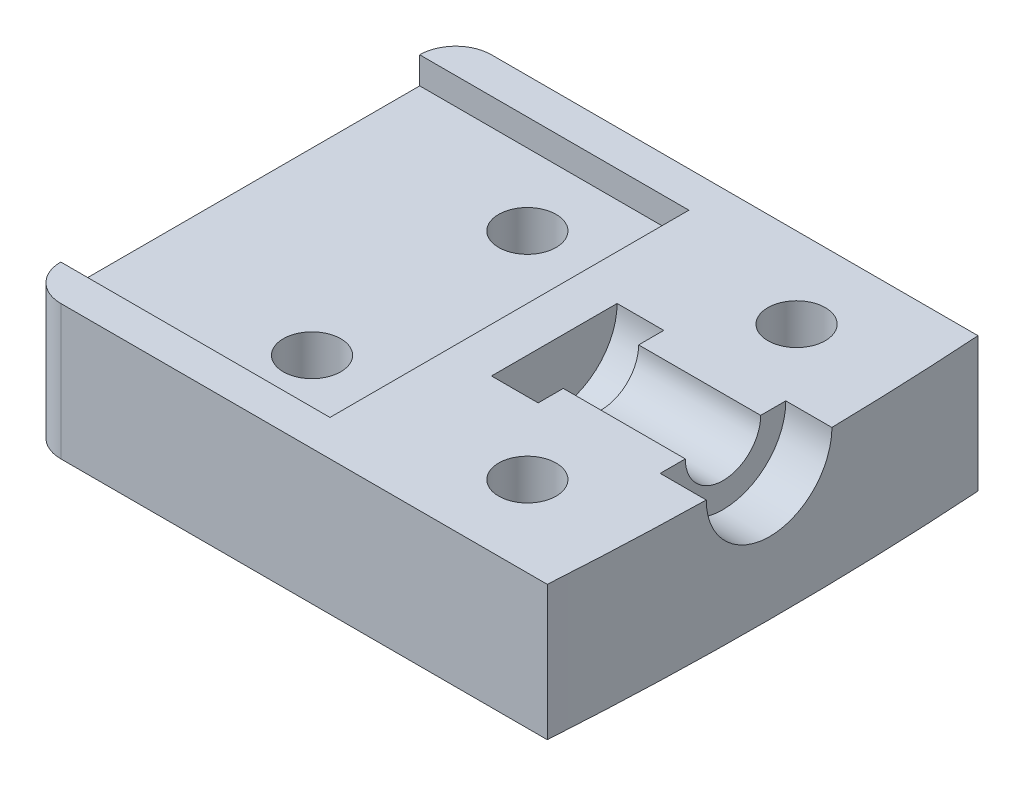
ISO-10303-21;
HEADER;
FILE_DESCRIPTION(('STEP AP214'),'2;1');
FILE_NAME('part.step','',(''),(''),'','','');
FILE_SCHEMA(('AUTOMOTIVE_DESIGN { 1 0 10303 214 1 1 1 1 }'));
ENDSEC;
DATA;
#1=APPLICATION_CONTEXT('core data for automotive mechanical design processes');
#2=APPLICATION_PROTOCOL_DEFINITION('international standard','automotive_design',2000,#1);
#3=PRODUCT_CONTEXT('',#1,'mechanical');
#4=PRODUCT('Part','Part','',(#3));
#5=PRODUCT_RELATED_PRODUCT_CATEGORY('part','',(#4));
#6=PRODUCT_DEFINITION_FORMATION('','',#4);
#7=PRODUCT_DEFINITION_CONTEXT('part definition',#1,'design');
#8=PRODUCT_DEFINITION('design','',#6,#7);
#9=PRODUCT_DEFINITION_SHAPE('','',#8);
#10=(LENGTH_UNIT() NAMED_UNIT(*) SI_UNIT(.MILLI.,.METRE.));
#11=(NAMED_UNIT(*) PLANE_ANGLE_UNIT() SI_UNIT($,.RADIAN.));
#12=(NAMED_UNIT(*) SI_UNIT($,.STERADIAN.) SOLID_ANGLE_UNIT());
#13=UNCERTAINTY_MEASURE_WITH_UNIT(LENGTH_MEASURE(1.E-05),#10,'distance_accuracy_value','');
#14=(GEOMETRIC_REPRESENTATION_CONTEXT(3) GLOBAL_UNCERTAINTY_ASSIGNED_CONTEXT((#13)) GLOBAL_UNIT_ASSIGNED_CONTEXT((#10,
#11,#12)) REPRESENTATION_CONTEXT('',''));
#15=CARTESIAN_POINT('',(0.,0.,0.));
#16=DIRECTION('',(0.,0.,1.));
#17=DIRECTION('',(1.,0.,0.));
#18=AXIS2_PLACEMENT_3D('',#15,#16,#17);
#19=CARTESIAN_POINT('',(-180.,10.,0.));
#20=DIRECTION('',(0.,-1.,0.));
#21=DIRECTION('',(0.,0.,-1.));
#22=AXIS2_PLACEMENT_3D('',#19,#20,#21);
#23=CYLINDRICAL_SURFACE('',#22,184.5);
#24=CARTESIAN_POINT('',(-180.,2.5,0.));
#25=DIRECTION('',(0.,-1.,0.));
#26=DIRECTION('',(0.,0.,-1.));
#27=AXIS2_PLACEMENT_3D('',#24,#25,#26);
#28=CIRCLE('',#27,184.5);
#29=CARTESIAN_POINT('',(4.10934251145431,2.5,-12.));
#30=VERTEX_POINT('',#29);
#31=CARTESIAN_POINT('',(4.10934251145434,2.5,11.9999999999999));
#32=VERTEX_POINT('',#31);
#33=EDGE_CURVE('E452',#30,#32,#28,.T.);
#34=ORIENTED_EDGE('',*,*,#33,.F.);
#35=DIRECTION('',(0.,-1.,0.));
#36=VECTOR('',#35,1.);
#37=CARTESIAN_POINT('',(4.10934251145431,10.,-12.));
#38=LINE('',#37,#36);
#39=CARTESIAN_POINT('',(4.10934251145431,10.,-12.));
#40=VERTEX_POINT('',#39);
#41=EDGE_CURVE('E483',#40,#30,#38,.T.);
#42=ORIENTED_EDGE('',*,*,#41,.F.);
#43=CARTESIAN_POINT('',(-180.,10.,0.));
#44=DIRECTION('',(0.,1.,0.));
#45=DIRECTION('',(0.,0.,1.));
#46=AXIS2_PLACEMENT_3D('',#43,#44,#45);
#47=CIRCLE('',#46,184.5);
#48=CARTESIAN_POINT('',(4.466799180774,10.,-3.49999999999999));
#49=VERTEX_POINT('',#48);
#50=EDGE_CURVE('E212',#49,#40,#47,.T.);
#51=ORIENTED_EDGE('',*,*,#50,.F.);
#52=CARTESIAN_POINT('',(4.466799180774,10.,3.50000000000004));
#53=CARTESIAN_POINT('',(4.46679841469484,9.90156883949017,3.50000944073101));
#54=CARTESIAN_POINT('',(4.46687794884017,9.80314216415495,3.49584773706264));
#55=CARTESIAN_POINT('',(4.46719196113814,9.60699316771199,3.47925510625905));
#56=CARTESIAN_POINT('',(4.46742643176911,9.50927081264448,3.46682458054951));
#57=CARTESIAN_POINT('',(4.46804444212397,9.3152850470878,3.43377909437891));
#58=CARTESIAN_POINT('',(4.46842787587904,9.21902064990752,3.4131699517684));
#59=CARTESIAN_POINT('',(4.46933226037499,9.02859401788498,3.36393456617535));
#60=CARTESIAN_POINT('',(4.46985320946417,8.93443175780879,3.3353084194844));
#61=CARTESIAN_POINT('',(4.4716021949422,8.65601031225504,3.23763720472101));
#62=CARTESIAN_POINT('',(4.47301665161284,8.47573366495137,3.1567851819177));
#63=CARTESIAN_POINT('',(4.47618203614662,8.13144868007693,2.9660236783445));
#64=CARTESIAN_POINT('',(4.47793289880444,7.96743719916688,2.85611982711916));
#65=CARTESIAN_POINT('',(4.48157446184482,7.66014106708052,2.61031668822488));
#66=CARTESIAN_POINT('',(4.48346518095077,7.5168591987157,2.47441391605144));
#67=CARTESIAN_POINT('',(4.48717336279079,7.25512900030599,2.18046445104212));
#68=CARTESIAN_POINT('',(4.48899081432567,7.13668445518806,2.0224143893231));
#69=CARTESIAN_POINT('',(4.49234733296518,6.92800586730905,1.68866349075336));
#70=CARTESIAN_POINT('',(4.49388639135575,6.83777270753644,1.51296210166091));
#71=CARTESIAN_POINT('',(4.49651243295992,6.68809225276604,1.14891232960233));
#72=CARTESIAN_POINT('',(4.49759944542518,6.62864296569952,0.960564765879647));
#73=CARTESIAN_POINT('',(4.49919889920214,6.54221443939616,0.576579150258367));
#74=CARTESIAN_POINT('',(4.49971139884895,6.51523190351767,0.380941840633406));
#75=CARTESIAN_POINT('',(4.50010425031963,6.49449277140174,-0.012091085463029));
#76=CARTESIAN_POINT('',(4.49998458816447,6.50073690990807,-0.209486740720561));
#77=CARTESIAN_POINT('',(4.49912663588495,6.54627206885379,-0.600399584207507));
#78=CARTESIAN_POINT('',(4.49838843154618,6.58555850666067,-0.793917306456734));
#79=CARTESIAN_POINT('',(4.496376714074,6.69605590842844,-1.17160937422262));
#80=CARTESIAN_POINT('',(4.49510320240867,6.76726678483673,-1.35578374536182));
#81=CARTESIAN_POINT('',(4.49216425328444,6.93959851038055,-1.70958011360381));
#82=CARTESIAN_POINT('',(4.4904987799545,7.04072209724615,-1.8792007768595));
#83=CARTESIAN_POINT('',(4.48696376189953,7.27000169243456,-2.19905083417319));
#84=CARTESIAN_POINT('',(4.4850942269777,7.39815640244578,-2.34928115899557));
#85=CARTESIAN_POINT('',(4.48136165081317,7.67786522475498,-2.62610194026429));
#86=CARTESIAN_POINT('',(4.47949860972356,7.82941988490857,-2.75269184307155));
#87=CARTESIAN_POINT('',(4.47598849710449,8.1516914376529,-2.97867220008211));
#88=CARTESIAN_POINT('',(4.47434149429857,8.32241439593754,-3.07805401004511));
#89=CARTESIAN_POINT('',(4.47144900138497,8.67819825043069,-3.24679188167776));
#90=CARTESIAN_POINT('',(4.47020375725949,8.86326784489361,-3.31612955729461));
#91=CARTESIAN_POINT('',(4.46825852240572,9.24227992085637,-3.4226426623696));
#92=CARTESIAN_POINT('',(4.46755769930326,9.43620837527823,-3.4598671997978));
#93=CARTESIAN_POINT('',(4.4670445760719,9.69285640137631,-3.48704420247958));
#94=CARTESIAN_POINT('',(4.46695259987882,9.75423850120095,-3.49190518857658));
#95=CARTESIAN_POINT('',(4.46682998424966,9.87707210825866,-3.49837865277695));
#96=CARTESIAN_POINT('',(4.46679924361665,9.93852333277886,-3.49999649048409));
#97=CARTESIAN_POINT('',(4.46679918077402,10.,-3.49999999999999));
#98=B_SPLINE_CURVE_WITH_KNOTS('',3,(#52,#53,#54,#55,#56,#57,#58,#59,#60,#61,#62,#63,#64,#65,#66,
#67,#68,#69,#70,#71,#72,#73,#74,#75,#76,#77,#78,#79,#80,#81,#82,#83,#84,#85,#86,#87,#88,#89,#90,
#91,#92,#93,#94,#95,#96,#97),.UNSPECIFIED.,.F.,.F.,(4,2,2,2,2,2,2,2,2,2,2,2,2,2,2,2,2,2,2,2,2,2,
4),(0.,0.295197414552304,0.590380499231028,0.885353981043384,1.18032392010528,1.77001496545767,
2.35959182654858,2.94924776108713,3.53899348732108,4.12875767016575,4.7184836837499,
5.30814981208619,5.89782897980496,6.48742637847426,7.07702216018609,7.66667192075088,
8.25629336673689,8.84592861943703,9.43575098740061,10.0259337998151,10.6152124864058,
10.7998757467791,10.9842335815568),.UNSPECIFIED.);
#99=CARTESIAN_POINT('',(4.466799180774,10.,3.50000000000004));
#100=VERTEX_POINT('',#99);
#101=EDGE_CURVE('E205',#100,#49,#98,.T.);
#102=ORIENTED_EDGE('',*,*,#101,.F.);
#103=CARTESIAN_POINT('',(4.10934251145431,10.,12.));
#104=VERTEX_POINT('',#103);
#105=EDGE_CURVE('E200',#104,#100,#47,.T.);
#106=ORIENTED_EDGE('',*,*,#105,.F.);
#107=DIRECTION('',(0.,-1.,0.));
#108=VECTOR('',#107,1.);
#109=CARTESIAN_POINT('',(4.10934251145431,10.,12.));
#110=LINE('',#109,#108);
#111=EDGE_CURVE('E479',#104,#32,#110,.T.);
#112=ORIENTED_EDGE('',*,*,#111,.T.);
#113=EDGE_LOOP('',(#34,#42,#51,#102,#106,#112));
#114=FACE_BOUND('',#113,.T.);
#115=ADVANCED_FACE('F36',(#114),#23,.T.);
#116=CARTESIAN_POINT('',(-25.,10.,0.));
#117=DIRECTION('',(-1.,0.,0.));
#118=DIRECTION('',(0.,0.,1.));
#119=AXIS2_PLACEMENT_3D('',#116,#117,#118);
#120=PLANE('',#119);
#121=DIRECTION('',(0.,-1.,0.));
#122=VECTOR('',#121,1.);
#123=CARTESIAN_POINT('',(-25.,0.,-9.99999999999999));
#124=LINE('',#123,#122);
#125=CARTESIAN_POINT('',(-25.,8.5,-10.));
#126=VERTEX_POINT('',#125);
#127=CARTESIAN_POINT('',(-25.,2.5,-9.99999999999999));
#128=VERTEX_POINT('',#127);
#129=EDGE_CURVE('E159',#126,#128,#124,.T.);
#130=ORIENTED_EDGE('',*,*,#129,.T.);
#131=DIRECTION('',(0.,0.,-1.));
#132=VECTOR('',#131,1.);
#133=CARTESIAN_POINT('',(-25.,2.5,10.));
#134=LINE('',#133,#132);
#135=CARTESIAN_POINT('',(-25.,2.5,10.));
#136=VERTEX_POINT('',#135);
#137=EDGE_CURVE('E146',#136,#128,#134,.T.);
#138=ORIENTED_EDGE('',*,*,#137,.F.);
#139=DIRECTION('',(0.,-1.,0.));
#140=VECTOR('',#139,1.);
#141=CARTESIAN_POINT('',(-25.,10.,10.));
#142=LINE('',#141,#140);
#143=CARTESIAN_POINT('',(-25.,8.5,10.));
#144=VERTEX_POINT('',#143);
#145=EDGE_CURVE('E157',#136,#144,#142,.F.);
#146=ORIENTED_EDGE('',*,*,#145,.T.);
#147=DIRECTION('',(0.,0.,1.));
#148=VECTOR('',#147,1.);
#149=CARTESIAN_POINT('',(-25.,8.5,-10.));
#150=LINE('',#149,#148);
#151=EDGE_CURVE('E505',#126,#144,#150,.T.);
#152=ORIENTED_EDGE('',*,*,#151,.F.);
#153=EDGE_LOOP('',(#130,#138,#146,#152));
#154=FACE_BOUND('',#153,.T.);
#155=ADVANCED_FACE('F155',(#154),#120,.T.);
#156=CARTESIAN_POINT('',(0.,10.,12.));
#157=DIRECTION('',(0.,0.,1.));
#158=DIRECTION('',(1.,0.,0.));
#159=AXIS2_PLACEMENT_3D('',#156,#157,#158);
#160=PLANE('',#159);
#161=DIRECTION('',(0.,-1.,0.));
#162=VECTOR('',#161,1.);
#163=CARTESIAN_POINT('',(-23.,10.,12.));
#164=LINE('',#163,#162);
#165=CARTESIAN_POINT('',(-23.,10.,12.));
#166=VERTEX_POINT('',#165);
#167=CARTESIAN_POINT('',(-23.,2.5,12.));
#168=VERTEX_POINT('',#167);
#169=EDGE_CURVE('E179',#166,#168,#164,.T.);
#170=ORIENTED_EDGE('',*,*,#169,.T.);
#171=DIRECTION('',(-1.,0.,0.));
#172=VECTOR('',#171,1.);
#173=CARTESIAN_POINT('',(4.10934251145434,2.5,11.9999999999999));
#174=LINE('',#173,#172);
#175=EDGE_CURVE('E52',#32,#168,#174,.T.);
#176=ORIENTED_EDGE('',*,*,#175,.F.);
#177=ORIENTED_EDGE('',*,*,#111,.F.);
#178=DIRECTION('',(-1.,0.,0.));
#179=VECTOR('',#178,1.);
#180=CARTESIAN_POINT('',(0.,10.,12.));
#181=LINE('',#180,#179);
#182=EDGE_CURVE('E490',#104,#166,#181,.T.);
#183=ORIENTED_EDGE('',*,*,#182,.T.);
#184=EDGE_LOOP('',(#170,#176,#177,#183));
#185=FACE_BOUND('',#184,.T.);
#186=ADVANCED_FACE('F277',(#185),#160,.T.);
#187=CARTESIAN_POINT('',(0.,10.,-12.));
#188=DIRECTION('',(0.,0.,1.));
#189=DIRECTION('',(1.,0.,0.));
#190=AXIS2_PLACEMENT_3D('',#187,#188,#189);
#191=PLANE('',#190);
#192=DIRECTION('',(1.,0.,0.));
#193=VECTOR('',#192,1.);
#194=CARTESIAN_POINT('',(-23.,2.5,-12.));
#195=LINE('',#194,#193);
#196=CARTESIAN_POINT('',(-23.,2.5,-12.));
#197=VERTEX_POINT('',#196);
#198=EDGE_CURVE('E454',#197,#30,#195,.T.);
#199=ORIENTED_EDGE('',*,*,#198,.F.);
#200=DIRECTION('',(0.,-1.,0.));
#201=VECTOR('',#200,1.);
#202=CARTESIAN_POINT('',(-23.,10.,-12.));
#203=LINE('',#202,#201);
#204=CARTESIAN_POINT('',(-23.,10.,-12.));
#205=VERTEX_POINT('',#204);
#206=EDGE_CURVE('E167',#197,#205,#203,.F.);
#207=ORIENTED_EDGE('',*,*,#206,.T.);
#208=DIRECTION('',(-1.,0.,0.));
#209=VECTOR('',#208,1.);
#210=CARTESIAN_POINT('',(0.,10.,-12.));
#211=LINE('',#210,#209);
#212=EDGE_CURVE('E486',#40,#205,#211,.T.);
#213=ORIENTED_EDGE('',*,*,#212,.F.);
#214=ORIENTED_EDGE('',*,*,#41,.T.);
#215=EDGE_LOOP('',(#199,#207,#213,#214));
#216=FACE_BOUND('',#215,.T.);
#217=ADVANCED_FACE('F274',(#216),#191,.F.);
#218=CARTESIAN_POINT('',(-23.,10.,-9.99999999999999));
#219=DIRECTION('',(0.,1.,0.));
#220=DIRECTION('',(0.,0.,1.));
#221=AXIS2_PLACEMENT_3D('',#218,#219,#220);
#222=CYLINDRICAL_SURFACE('',#221,2.);
#223=ORIENTED_EDGE('',*,*,#206,.F.);
#224=CARTESIAN_POINT('',(-23.,2.5,-9.99999999999999));
#225=DIRECTION('',(0.,-1.,0.));
#226=DIRECTION('',(0.,0.,-1.));
#227=AXIS2_PLACEMENT_3D('',#224,#225,#226);
#228=CIRCLE('',#227,2.);
#229=EDGE_CURVE('E160',#128,#197,#228,.T.);
#230=ORIENTED_EDGE('',*,*,#229,.F.);
#231=ORIENTED_EDGE('',*,*,#129,.F.);
#232=DIRECTION('',(0.,1.,0.));
#233=VECTOR('',#232,1.);
#234=CARTESIAN_POINT('',(-25.,8.5,-10.));
#235=LINE('',#234,#233);
#236=CARTESIAN_POINT('',(-25.,10.,-10.));
#237=VERTEX_POINT('',#236);
#238=EDGE_CURVE('E493',#126,#237,#235,.T.);
#239=ORIENTED_EDGE('',*,*,#238,.T.);
#240=CARTESIAN_POINT('',(-23.,10.,-9.99999999999999));
#241=DIRECTION('',(0.,1.,0.));
#242=DIRECTION('',(0.,0.,1.));
#243=AXIS2_PLACEMENT_3D('',#240,#241,#242);
#244=CIRCLE('',#243,2.);
#245=EDGE_CURVE('E177',#205,#237,#244,.T.);
#246=ORIENTED_EDGE('',*,*,#245,.F.);
#247=EDGE_LOOP('',(#223,#230,#231,#239,#246));
#248=FACE_BOUND('',#247,.T.);
#249=ADVANCED_FACE('F276',(#248),#222,.T.);
#250=CARTESIAN_POINT('',(-23.,10.,10.));
#251=DIRECTION('',(0.,-1.,0.));
#252=DIRECTION('',(0.,0.,-1.));
#253=AXIS2_PLACEMENT_3D('',#250,#251,#252);
#254=CYLINDRICAL_SURFACE('',#253,2.);
#255=ORIENTED_EDGE('',*,*,#145,.F.);
#256=CARTESIAN_POINT('',(-23.,2.5,10.));
#257=DIRECTION('',(0.,-1.,0.));
#258=DIRECTION('',(0.,0.,-1.));
#259=AXIS2_PLACEMENT_3D('',#256,#257,#258);
#260=CIRCLE('',#259,2.);
#261=EDGE_CURVE('E142',#168,#136,#260,.T.);
#262=ORIENTED_EDGE('',*,*,#261,.F.);
#263=ORIENTED_EDGE('',*,*,#169,.F.);
#264=CARTESIAN_POINT('',(-23.,10.,10.));
#265=DIRECTION('',(0.,1.,0.));
#266=DIRECTION('',(0.,0.,1.));
#267=AXIS2_PLACEMENT_3D('',#264,#265,#266);
#268=CIRCLE('',#267,2.);
#269=CARTESIAN_POINT('',(-25.,10.,9.99999999999999));
#270=VERTEX_POINT('',#269);
#271=EDGE_CURVE('E175',#270,#166,#268,.T.);
#272=ORIENTED_EDGE('',*,*,#271,.F.);
#273=DIRECTION('',(0.,1.,0.));
#274=VECTOR('',#273,1.);
#275=CARTESIAN_POINT('',(-25.,8.5,10.));
#276=LINE('',#275,#274);
#277=EDGE_CURVE('E164',#144,#270,#276,.T.);
#278=ORIENTED_EDGE('',*,*,#277,.F.);
#279=EDGE_LOOP('',(#255,#262,#263,#272,#278));
#280=FACE_BOUND('',#279,.T.);
#281=ADVANCED_FACE('F38',(#280),#254,.T.);
#282=CARTESIAN_POINT('',(-14.9999999999999,8.5,6.00000000000002));
#283=DIRECTION('',(0.,1.,0.));
#284=DIRECTION('',(0.,0.,1.));
#285=AXIS2_PLACEMENT_3D('',#282,#283,#284);
#286=CYLINDRICAL_SURFACE('',#285,1.6);
#287=CARTESIAN_POINT('',(-14.9999999999999,8.5,6.00000000000002));
#288=DIRECTION('',(0.,1.,0.));
#289=DIRECTION('',(0.,0.,1.));
#290=AXIS2_PLACEMENT_3D('',#287,#288,#289);
#291=CIRCLE('',#290,1.6);
#292=CARTESIAN_POINT('',(-14.9999999999999,8.5,7.60000000000002));
#293=VERTEX_POINT('',#292);
#294=EDGE_CURVE('E470',#293,#293,#291,.T.);
#295=ORIENTED_EDGE('',*,*,#294,.T.);
#296=EDGE_LOOP('',(#295));
#297=FACE_BOUND('',#296,.T.);
#298=CARTESIAN_POINT('',(-14.9999999999999,2.5,6.00000000000002));
#299=DIRECTION('',(0.,-1.,0.));
#300=DIRECTION('',(0.,0.,-1.));
#301=AXIS2_PLACEMENT_3D('',#298,#299,#300);
#302=CIRCLE('',#301,1.6);
#303=CARTESIAN_POINT('',(-14.9999999999999,2.5,4.40000000000002));
#304=VERTEX_POINT('',#303);
#305=EDGE_CURVE('E460',#304,#304,#302,.F.);
#306=ORIENTED_EDGE('',*,*,#305,.F.);
#307=EDGE_LOOP('',(#306));
#308=FACE_BOUND('',#307,.T.);
#309=ADVANCED_FACE('F235',(#297,#308),#286,.F.);
#310=CARTESIAN_POINT('',(-14.9999999999999,8.5,-5.99999999999998));
#311=DIRECTION('',(0.,1.,0.));
#312=DIRECTION('',(0.,0.,1.));
#313=AXIS2_PLACEMENT_3D('',#310,#311,#312);
#314=CYLINDRICAL_SURFACE('',#313,1.6);
#315=CARTESIAN_POINT('',(-14.9999999999999,8.5,-5.99999999999998));
#316=DIRECTION('',(0.,1.,0.));
#317=DIRECTION('',(0.,0.,1.));
#318=AXIS2_PLACEMENT_3D('',#315,#316,#317);
#319=CIRCLE('',#318,1.6);
#320=CARTESIAN_POINT('',(-14.9999999999999,8.5,-4.39999999999998));
#321=VERTEX_POINT('',#320);
#322=EDGE_CURVE('E467',#321,#321,#319,.T.);
#323=ORIENTED_EDGE('',*,*,#322,.T.);
#324=EDGE_LOOP('',(#323));
#325=FACE_BOUND('',#324,.T.);
#326=CARTESIAN_POINT('',(-14.9999999999999,2.5,-5.99999999999998));
#327=DIRECTION('',(0.,-1.,0.));
#328=DIRECTION('',(0.,0.,-1.));
#329=AXIS2_PLACEMENT_3D('',#326,#327,#328);
#330=CIRCLE('',#329,1.6);
#331=CARTESIAN_POINT('',(-14.9999999999999,2.5,-7.59999999999998));
#332=VERTEX_POINT('',#331);
#333=EDGE_CURVE('E450',#332,#332,#330,.F.);
#334=ORIENTED_EDGE('',*,*,#333,.F.);
#335=EDGE_LOOP('',(#334));
#336=FACE_BOUND('',#335,.T.);
#337=ADVANCED_FACE('F325',(#325,#336),#314,.F.);
#338=CARTESIAN_POINT('',(-1.5,10.,7.5));
#339=DIRECTION('',(0.,1.,0.));
#340=DIRECTION('',(0.,0.,1.));
#341=AXIS2_PLACEMENT_3D('',#338,#339,#340);
#342=CYLINDRICAL_SURFACE('',#341,1.6);
#343=CARTESIAN_POINT('',(-1.5,10.,7.5));
#344=DIRECTION('',(0.,1.,0.));
#345=DIRECTION('',(0.,0.,1.));
#346=AXIS2_PLACEMENT_3D('',#343,#344,#345);
#347=CIRCLE('',#346,1.6);
#348=CARTESIAN_POINT('',(-1.5,10.,9.1));
#349=VERTEX_POINT('',#348);
#350=EDGE_CURVE('E464',#349,#349,#347,.T.);
#351=ORIENTED_EDGE('',*,*,#350,.T.);
#352=EDGE_LOOP('',(#351));
#353=FACE_BOUND('',#352,.T.);
#354=CARTESIAN_POINT('',(-1.5,2.5,7.5));
#355=DIRECTION('',(0.,-1.,0.));
#356=DIRECTION('',(0.,0.,-1.));
#357=AXIS2_PLACEMENT_3D('',#354,#355,#356);
#358=CIRCLE('',#357,1.6);
#359=CARTESIAN_POINT('',(-1.5,2.5,5.9));
#360=VERTEX_POINT('',#359);
#361=EDGE_CURVE('E448',#360,#360,#358,.F.);
#362=ORIENTED_EDGE('',*,*,#361,.F.);
#363=EDGE_LOOP('',(#362));
#364=FACE_BOUND('',#363,.T.);
#365=ADVANCED_FACE('F334',(#353,#364),#342,.F.);
#366=CARTESIAN_POINT('',(-1.5,10.,-7.5));
#367=DIRECTION('',(0.,1.,0.));
#368=DIRECTION('',(0.,0.,1.));
#369=AXIS2_PLACEMENT_3D('',#366,#367,#368);
#370=CYLINDRICAL_SURFACE('',#369,1.6);
#371=CARTESIAN_POINT('',(-1.5,10.,-7.5));
#372=DIRECTION('',(0.,1.,0.));
#373=DIRECTION('',(0.,0.,1.));
#374=AXIS2_PLACEMENT_3D('',#371,#372,#373);
#375=CIRCLE('',#374,1.6);
#376=CARTESIAN_POINT('',(-1.5,10.,-5.9));
#377=VERTEX_POINT('',#376);
#378=EDGE_CURVE('E445',#377,#377,#375,.T.);
#379=ORIENTED_EDGE('',*,*,#378,.T.);
#380=EDGE_LOOP('',(#379));
#381=FACE_BOUND('',#380,.T.);
#382=CARTESIAN_POINT('',(-1.5,2.5,-7.5));
#383=DIRECTION('',(0.,-1.,0.));
#384=DIRECTION('',(0.,0.,-1.));
#385=AXIS2_PLACEMENT_3D('',#382,#383,#384);
#386=CIRCLE('',#385,1.6);
#387=CARTESIAN_POINT('',(-1.5,2.5,-9.1));
#388=VERTEX_POINT('',#387);
#389=EDGE_CURVE('E40',#388,#388,#386,.F.);
#390=ORIENTED_EDGE('',*,*,#389,.F.);
#391=EDGE_LOOP('',(#390));
#392=FACE_BOUND('',#391,.T.);
#393=ADVANCED_FACE('F272',(#381,#392),#370,.F.);
#394=CARTESIAN_POINT('',(0.,10.,0.));
#395=DIRECTION('',(0.,1.,0.));
#396=DIRECTION('',(0.,0.,1.));
#397=AXIS2_PLACEMENT_3D('',#394,#395,#396);
#398=PLANE('',#397);
#399=ORIENTED_EDGE('',*,*,#378,.F.);
#400=EDGE_LOOP('',(#399));
#401=FACE_BOUND('',#400,.T.);
#402=ORIENTED_EDGE('',*,*,#350,.F.);
#403=EDGE_LOOP('',(#402));
#404=FACE_BOUND('',#403,.T.);
#405=DIRECTION('',(-1.,0.,0.));
#406=VECTOR('',#405,1.);
#407=CARTESIAN_POINT('',(4.5,10.,-2.1));
#408=LINE('',#407,#406);
#409=CARTESIAN_POINT('',(-4.9,10.,-2.1));
#410=VERTEX_POINT('',#409);
#411=CARTESIAN_POINT('',(1.90000000000001,10.,-2.1));
#412=VERTEX_POINT('',#411);
#413=EDGE_CURVE('E165',#410,#412,#408,.F.);
#414=ORIENTED_EDGE('',*,*,#413,.T.);
#415=DIRECTION('',(0.,0.,-1.));
#416=VECTOR('',#415,1.);
#417=CARTESIAN_POINT('',(1.9,10.,0.));
#418=LINE('',#417,#416);
#419=CARTESIAN_POINT('',(1.9,10.,-3.5));
#420=VERTEX_POINT('',#419);
#421=EDGE_CURVE('E60',#412,#420,#418,.T.);
#422=ORIENTED_EDGE('',*,*,#421,.T.);
#423=DIRECTION('',(-1.,0.,0.));
#424=VECTOR('',#423,1.);
#425=CARTESIAN_POINT('',(0.,10.,-3.50000000000002));
#426=LINE('',#425,#424);
#427=EDGE_CURVE('E11',#420,#49,#426,.F.);
#428=ORIENTED_EDGE('',*,*,#427,.T.);
#429=ORIENTED_EDGE('',*,*,#50,.T.);
#430=ORIENTED_EDGE('',*,*,#212,.T.);
#431=ORIENTED_EDGE('',*,*,#245,.T.);
#432=DIRECTION('',(-1.,0.,0.));
#433=VECTOR('',#432,1.);
#434=CARTESIAN_POINT('',(-25.,10.,-10.));
#435=LINE('',#434,#433);
#436=CARTESIAN_POINT('',(-10.,10.,-10.));
#437=VERTEX_POINT('',#436);
#438=EDGE_CURVE('E502',#437,#237,#435,.T.);
#439=ORIENTED_EDGE('',*,*,#438,.F.);
#440=DIRECTION('',(0.,0.,-1.));
#441=VECTOR('',#440,1.);
#442=CARTESIAN_POINT('',(-10.,10.,-10.));
#443=LINE('',#442,#441);
#444=CARTESIAN_POINT('',(-10.,10.,9.99999999999999));
#445=VERTEX_POINT('',#444);
#446=EDGE_CURVE('E506',#445,#437,#443,.T.);
#447=ORIENTED_EDGE('',*,*,#446,.F.);
#448=DIRECTION('',(1.,0.,0.));
#449=VECTOR('',#448,1.);
#450=CARTESIAN_POINT('',(-25.,10.,10.));
#451=LINE('',#450,#449);
#452=EDGE_CURVE('E509',#270,#445,#451,.T.);
#453=ORIENTED_EDGE('',*,*,#452,.F.);
#454=ORIENTED_EDGE('',*,*,#271,.T.);
#455=ORIENTED_EDGE('',*,*,#182,.F.);
#456=ORIENTED_EDGE('',*,*,#105,.T.);
#457=DIRECTION('',(-1.,0.,0.));
#458=VECTOR('',#457,1.);
#459=CARTESIAN_POINT('',(0.,10.,3.50000000000002));
#460=LINE('',#459,#458);
#461=CARTESIAN_POINT('',(1.89999999999997,10.,3.50000000000002));
#462=VERTEX_POINT('',#461);
#463=EDGE_CURVE('E45',#100,#462,#460,.T.);
#464=ORIENTED_EDGE('',*,*,#463,.T.);
#465=CARTESIAN_POINT('',(1.89999999999999,10.,2.1));
#466=VERTEX_POINT('',#465);
#467=EDGE_CURVE('E196',#462,#466,#418,.T.);
#468=ORIENTED_EDGE('',*,*,#467,.T.);
#469=DIRECTION('',(-1.,0.,0.));
#470=VECTOR('',#469,1.);
#471=CARTESIAN_POINT('',(4.5,10.,2.1));
#472=LINE('',#471,#470);
#473=CARTESIAN_POINT('',(-4.9,10.,2.1));
#474=VERTEX_POINT('',#473);
#475=EDGE_CURVE('E170',#466,#474,#472,.T.);
#476=ORIENTED_EDGE('',*,*,#475,.T.);
#477=DIRECTION('',(0.,0.,-1.));
#478=VECTOR('',#477,1.);
#479=CARTESIAN_POINT('',(-4.9,10.,0.));
#480=LINE('',#479,#478);
#481=CARTESIAN_POINT('',(-4.9,10.,3.5));
#482=VERTEX_POINT('',#481);
#483=EDGE_CURVE('E512',#482,#474,#480,.T.);
#484=ORIENTED_EDGE('',*,*,#483,.F.);
#485=DIRECTION('',(-1.,0.,0.));
#486=VECTOR('',#485,1.);
#487=CARTESIAN_POINT('',(-4.9,10.,3.5));
#488=LINE('',#487,#486);
#489=CARTESIAN_POINT('',(-7.5,10.,3.5));
#490=VERTEX_POINT('',#489);
#491=EDGE_CURVE('E186',#482,#490,#488,.T.);
#492=ORIENTED_EDGE('',*,*,#491,.T.);
#493=DIRECTION('',(0.,0.,-1.));
#494=VECTOR('',#493,1.);
#495=CARTESIAN_POINT('',(-7.5,10.,0.));
#496=LINE('',#495,#494);
#497=CARTESIAN_POINT('',(-7.5,10.,-3.5));
#498=VERTEX_POINT('',#497);
#499=EDGE_CURVE('E478',#490,#498,#496,.T.);
#500=ORIENTED_EDGE('',*,*,#499,.T.);
#501=DIRECTION('',(-1.,0.,0.));
#502=VECTOR('',#501,1.);
#503=CARTESIAN_POINT('',(-4.9,10.,-3.5));
#504=LINE('',#503,#502);
#505=CARTESIAN_POINT('',(-4.9,10.,-3.5));
#506=VERTEX_POINT('',#505);
#507=EDGE_CURVE('E183',#498,#506,#504,.F.);
#508=ORIENTED_EDGE('',*,*,#507,.T.);
#509=EDGE_CURVE('E474',#410,#506,#480,.T.);
#510=ORIENTED_EDGE('',*,*,#509,.F.);
#511=EDGE_LOOP('',(#414,#422,#428,#429,#430,#431,#439,#447,#453,#454,#455,#456,#464,#468,#476,
#484,#492,#500,#508,#510));
#512=FACE_BOUND('',#511,.T.);
#513=ADVANCED_FACE('F195',(#401,#404,#512),#398,.T.);
#514=CARTESIAN_POINT('',(4.5,10.,0.));
#515=DIRECTION('',(-1.,0.,0.));
#516=DIRECTION('',(0.,0.,1.));
#517=AXIS2_PLACEMENT_3D('',#514,#515,#516);
#518=CYLINDRICAL_SURFACE('',#517,2.1);
#519=ORIENTED_EDGE('',*,*,#475,.F.);
#520=CARTESIAN_POINT('',(1.9,10.,0.));
#521=DIRECTION('',(1.,0.,0.));
#522=DIRECTION('',(0.,0.,-1.));
#523=AXIS2_PLACEMENT_3D('',#520,#521,#522);
#524=CIRCLE('',#523,2.1);
#525=EDGE_CURVE('E189',#466,#412,#524,.T.);
#526=ORIENTED_EDGE('',*,*,#525,.T.);
#527=ORIENTED_EDGE('',*,*,#413,.F.);
#528=CARTESIAN_POINT('',(-4.9,10.,0.));
#529=DIRECTION('',(1.,0.,0.));
#530=DIRECTION('',(0.,0.,-1.));
#531=AXIS2_PLACEMENT_3D('',#528,#529,#530);
#532=CIRCLE('',#531,2.1);
#533=EDGE_CURVE('E181',#474,#410,#532,.T.);
#534=ORIENTED_EDGE('',*,*,#533,.F.);
#535=EDGE_LOOP('',(#519,#526,#527,#534));
#536=FACE_BOUND('',#535,.T.);
#537=ADVANCED_FACE('F252',(#536),#518,.F.);
#538=CARTESIAN_POINT('',(-25.,8.5,-10.));
#539=DIRECTION('',(0.,0.,-1.));
#540=DIRECTION('',(-1.,0.,0.));
#541=AXIS2_PLACEMENT_3D('',#538,#539,#540);
#542=PLANE('',#541);
#543=ORIENTED_EDGE('',*,*,#438,.T.);
#544=ORIENTED_EDGE('',*,*,#238,.F.);
#545=DIRECTION('',(-1.,0.,0.));
#546=VECTOR('',#545,1.);
#547=CARTESIAN_POINT('',(-25.,8.5,-10.));
#548=LINE('',#547,#546);
#549=CARTESIAN_POINT('',(-10.,8.5,-10.));
#550=VERTEX_POINT('',#549);
#551=EDGE_CURVE('E496',#550,#126,#548,.T.);
#552=ORIENTED_EDGE('',*,*,#551,.F.);
#553=DIRECTION('',(0.,1.,0.));
#554=VECTOR('',#553,1.);
#555=CARTESIAN_POINT('',(-10.,8.5,-10.));
#556=LINE('',#555,#554);
#557=EDGE_CURVE('E498',#550,#437,#556,.T.);
#558=ORIENTED_EDGE('',*,*,#557,.T.);
#559=EDGE_LOOP('',(#543,#544,#552,#558));
#560=FACE_BOUND('',#559,.T.);
#561=ADVANCED_FACE('F255',(#560),#542,.F.);
#562=CARTESIAN_POINT('',(-10.,8.5,-10.));
#563=DIRECTION('',(1.,0.,0.));
#564=DIRECTION('',(0.,0.,-1.));
#565=AXIS2_PLACEMENT_3D('',#562,#563,#564);
#566=PLANE('',#565);
#567=ORIENTED_EDGE('',*,*,#446,.T.);
#568=ORIENTED_EDGE('',*,*,#557,.F.);
#569=DIRECTION('',(0.,0.,-1.));
#570=VECTOR('',#569,1.);
#571=CARTESIAN_POINT('',(-10.,8.5,-10.));
#572=LINE('',#571,#570);
#573=CARTESIAN_POINT('',(-10.,8.5,9.99999999999999));
#574=VERTEX_POINT('',#573);
#575=EDGE_CURVE('E515',#574,#550,#572,.T.);
#576=ORIENTED_EDGE('',*,*,#575,.F.);
#577=DIRECTION('',(0.,1.,0.));
#578=VECTOR('',#577,1.);
#579=CARTESIAN_POINT('',(-10.,8.5,9.99999999999999));
#580=LINE('',#579,#578);
#581=EDGE_CURVE('E495',#574,#445,#580,.T.);
#582=ORIENTED_EDGE('',*,*,#581,.T.);
#583=EDGE_LOOP('',(#567,#568,#576,#582));
#584=FACE_BOUND('',#583,.T.);
#585=ADVANCED_FACE('F263',(#584),#566,.F.);
#586=CARTESIAN_POINT('',(-25.,8.5,10.));
#587=DIRECTION('',(0.,0.,1.));
#588=DIRECTION('',(1.,0.,0.));
#589=AXIS2_PLACEMENT_3D('',#586,#587,#588);
#590=PLANE('',#589);
#591=ORIENTED_EDGE('',*,*,#452,.T.);
#592=ORIENTED_EDGE('',*,*,#581,.F.);
#593=DIRECTION('',(1.,0.,0.));
#594=VECTOR('',#593,1.);
#595=CARTESIAN_POINT('',(-25.,8.5,10.));
#596=LINE('',#595,#594);
#597=EDGE_CURVE('E518',#144,#574,#596,.T.);
#598=ORIENTED_EDGE('',*,*,#597,.F.);
#599=ORIENTED_EDGE('',*,*,#277,.T.);
#600=EDGE_LOOP('',(#591,#592,#598,#599));
#601=FACE_BOUND('',#600,.T.);
#602=ADVANCED_FACE('F259',(#601),#590,.F.);
#603=CARTESIAN_POINT('',(0.,8.5,0.));
#604=DIRECTION('',(0.,1.,0.));
#605=DIRECTION('',(0.,0.,1.));
#606=AXIS2_PLACEMENT_3D('',#603,#604,#605);
#607=PLANE('',#606);
#608=ORIENTED_EDGE('',*,*,#322,.F.);
#609=EDGE_LOOP('',(#608));
#610=FACE_BOUND('',#609,.T.);
#611=ORIENTED_EDGE('',*,*,#294,.F.);
#612=EDGE_LOOP('',(#611));
#613=FACE_BOUND('',#612,.T.);
#614=ORIENTED_EDGE('',*,*,#151,.T.);
#615=ORIENTED_EDGE('',*,*,#597,.T.);
#616=ORIENTED_EDGE('',*,*,#575,.T.);
#617=ORIENTED_EDGE('',*,*,#551,.T.);
#618=EDGE_LOOP('',(#614,#615,#616,#617));
#619=FACE_BOUND('',#618,.T.);
#620=ADVANCED_FACE('F250',(#610,#613,#619),#607,.T.);
#621=CARTESIAN_POINT('',(-7.5,10.,0.));
#622=DIRECTION('',(1.,0.,0.));
#623=DIRECTION('',(0.,0.,-1.));
#624=AXIS2_PLACEMENT_3D('',#621,#622,#623);
#625=PLANE('',#624);
#626=ORIENTED_EDGE('',*,*,#499,.F.);
#627=CARTESIAN_POINT('',(-7.5,10.,0.));
#628=DIRECTION('',(1.,0.,0.));
#629=DIRECTION('',(0.,0.,-1.));
#630=AXIS2_PLACEMENT_3D('',#627,#628,#629);
#631=CIRCLE('',#630,3.5);
#632=EDGE_CURVE('E213',#490,#498,#631,.T.);
#633=ORIENTED_EDGE('',*,*,#632,.T.);
#634=EDGE_LOOP('',(#626,#633));
#635=FACE_BOUND('',#634,.T.);
#636=ADVANCED_FACE('F246',(#635),#625,.T.);
#637=CARTESIAN_POINT('',(-4.9,10.,0.));
#638=DIRECTION('',(-1.,0.,0.));
#639=DIRECTION('',(0.,0.,1.));
#640=AXIS2_PLACEMENT_3D('',#637,#638,#639);
#641=CYLINDRICAL_SURFACE('',#640,3.5);
#642=ORIENTED_EDGE('',*,*,#632,.F.);
#643=ORIENTED_EDGE('',*,*,#491,.F.);
#644=CARTESIAN_POINT('',(-4.9,10.,0.));
#645=DIRECTION('',(1.,0.,0.));
#646=DIRECTION('',(0.,0.,-1.));
#647=AXIS2_PLACEMENT_3D('',#644,#645,#646);
#648=CIRCLE('',#647,3.5);
#649=EDGE_CURVE('E216',#482,#506,#648,.T.);
#650=ORIENTED_EDGE('',*,*,#649,.T.);
#651=ORIENTED_EDGE('',*,*,#507,.F.);
#652=EDGE_LOOP('',(#642,#643,#650,#651));
#653=FACE_BOUND('',#652,.T.);
#654=ADVANCED_FACE('F242',(#653),#641,.F.);
#655=CARTESIAN_POINT('',(-4.9,10.,0.));
#656=DIRECTION('',(1.,0.,0.));
#657=DIRECTION('',(0.,0.,-1.));
#658=AXIS2_PLACEMENT_3D('',#655,#656,#657);
#659=PLANE('',#658);
#660=ORIENTED_EDGE('',*,*,#483,.T.);
#661=ORIENTED_EDGE('',*,*,#533,.T.);
#662=ORIENTED_EDGE('',*,*,#509,.T.);
#663=ORIENTED_EDGE('',*,*,#649,.F.);
#664=EDGE_LOOP('',(#660,#661,#662,#663));
#665=FACE_BOUND('',#664,.T.);
#666=ADVANCED_FACE('F239',(#665),#659,.F.);
#667=CARTESIAN_POINT('',(1.9,10.,0.));
#668=DIRECTION('',(1.,0.,0.));
#669=DIRECTION('',(0.,0.,-1.));
#670=AXIS2_PLACEMENT_3D('',#667,#668,#669);
#671=PLANE('',#670);
#672=CARTESIAN_POINT('',(1.89999999999999,10.,0.));
#673=DIRECTION('',(-1.,0.,0.));
#674=DIRECTION('',(0.,0.,1.));
#675=AXIS2_PLACEMENT_3D('',#672,#673,#674);
#676=CIRCLE('',#675,3.50000000000001);
#677=EDGE_CURVE('E206',#420,#462,#676,.T.);
#678=ORIENTED_EDGE('',*,*,#677,.F.);
#679=ORIENTED_EDGE('',*,*,#421,.F.);
#680=ORIENTED_EDGE('',*,*,#525,.F.);
#681=ORIENTED_EDGE('',*,*,#467,.F.);
#682=EDGE_LOOP('',(#678,#679,#680,#681));
#683=FACE_BOUND('',#682,.T.);
#684=ADVANCED_FACE('F234',(#683),#671,.T.);
#685=CARTESIAN_POINT('',(0.,10.,0.));
#686=DIRECTION('',(-1.,0.,0.));
#687=DIRECTION('',(0.,0.,1.));
#688=AXIS2_PLACEMENT_3D('',#685,#686,#687);
#689=CYLINDRICAL_SURFACE('',#688,3.50000000000002);
#690=ORIENTED_EDGE('',*,*,#677,.T.);
#691=ORIENTED_EDGE('',*,*,#463,.F.);
#692=ORIENTED_EDGE('',*,*,#101,.T.);
#693=ORIENTED_EDGE('',*,*,#427,.F.);
#694=EDGE_LOOP('',(#690,#691,#692,#693));
#695=FACE_BOUND('',#694,.T.);
#696=ADVANCED_FACE('F204',(#695),#689,.F.);
#697=CARTESIAN_POINT('',(-23.,2.5,10.));
#698=DIRECTION('',(0.,-1.,0.));
#699=DIRECTION('',(0.,0.,-1.));
#700=AXIS2_PLACEMENT_3D('',#697,#698,#699);
#701=PLANE('',#700);
#702=ORIENTED_EDGE('',*,*,#261,.T.);
#703=ORIENTED_EDGE('',*,*,#137,.T.);
#704=ORIENTED_EDGE('',*,*,#229,.T.);
#705=ORIENTED_EDGE('',*,*,#198,.T.);
#706=ORIENTED_EDGE('',*,*,#33,.T.);
#707=ORIENTED_EDGE('',*,*,#175,.T.);
#708=EDGE_LOOP('',(#702,#703,#704,#705,#706,#707));
#709=FACE_BOUND('',#708,.T.);
#710=ORIENTED_EDGE('',*,*,#389,.T.);
#711=EDGE_LOOP('',(#710));
#712=FACE_BOUND('',#711,.T.);
#713=ORIENTED_EDGE('',*,*,#361,.T.);
#714=EDGE_LOOP('',(#713));
#715=FACE_BOUND('',#714,.T.);
#716=ORIENTED_EDGE('',*,*,#333,.T.);
#717=EDGE_LOOP('',(#716));
#718=FACE_BOUND('',#717,.T.);
#719=ORIENTED_EDGE('',*,*,#305,.T.);
#720=EDGE_LOOP('',(#719));
#721=FACE_BOUND('',#720,.T.);
#722=ADVANCED_FACE('F144',(#709,#712,#715,#718,#721),#701,.T.);
#723=CLOSED_SHELL('',(#115,#155,#186,#217,#249,#281,#309,#337,#365,#393,#513,#537,#561,#585,
#602,#620,#636,#654,#666,#684,#696,#722));
#724=MANIFOLD_SOLID_BREP('B2',#723);
#725=ADVANCED_BREP_SHAPE_REPRESENTATION('',(#18,#724),#14);
#726=SHAPE_DEFINITION_REPRESENTATION(#9,#725);
ENDSEC;
END-ISO-10303-21;
